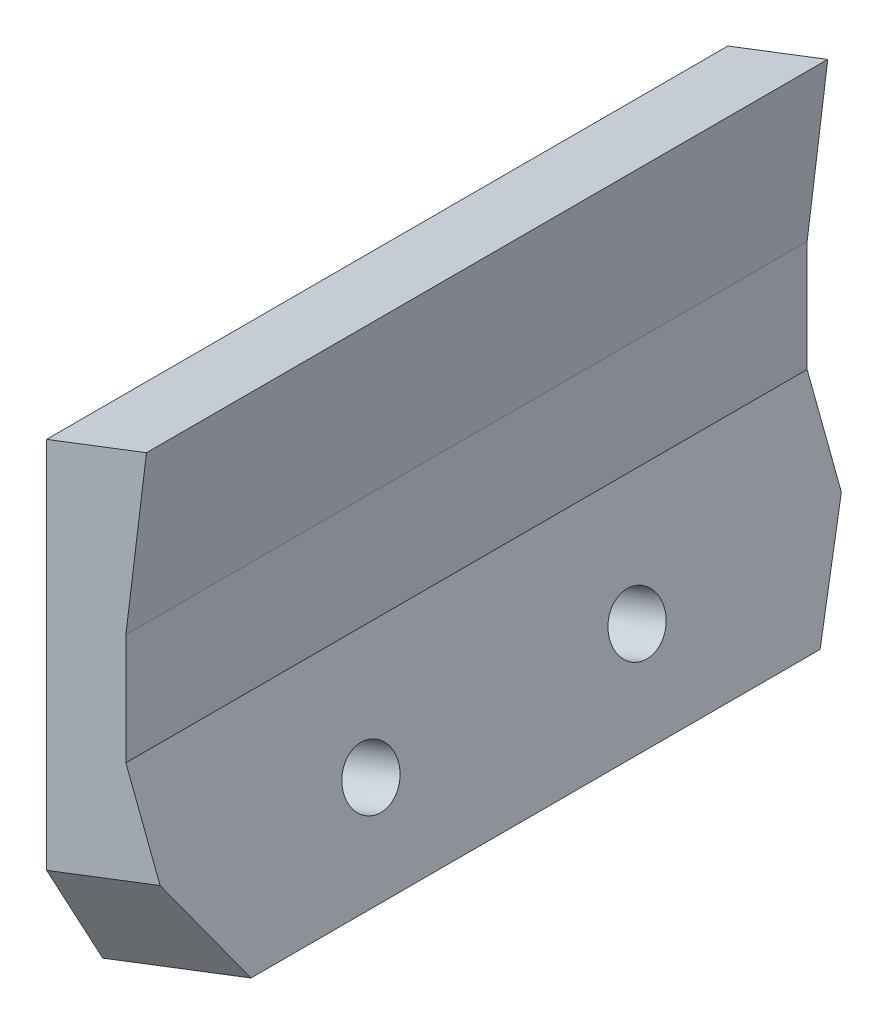
ISO-10303-21;
HEADER;
FILE_DESCRIPTION(('STEP AP214'),'2;1');
FILE_NAME('part.step','',(''),(''),'','','');
FILE_SCHEMA(('AUTOMOTIVE_DESIGN { 1 0 10303 214 1 1 1 1 }'));
ENDSEC;
DATA;
#1=APPLICATION_CONTEXT('core data for automotive mechanical design processes');
#2=APPLICATION_PROTOCOL_DEFINITION('international standard','automotive_design',2000,#1);
#3=PRODUCT_CONTEXT('',#1,'mechanical');
#4=PRODUCT('Part','Part','',(#3));
#5=PRODUCT_RELATED_PRODUCT_CATEGORY('part','',(#4));
#6=PRODUCT_DEFINITION_FORMATION('','',#4);
#7=PRODUCT_DEFINITION_CONTEXT('part definition',#1,'design');
#8=PRODUCT_DEFINITION('design','',#6,#7);
#9=PRODUCT_DEFINITION_SHAPE('','',#8);
#10=(LENGTH_UNIT() NAMED_UNIT(*) SI_UNIT(.MILLI.,.METRE.));
#11=(NAMED_UNIT(*) PLANE_ANGLE_UNIT() SI_UNIT($,.RADIAN.));
#12=(NAMED_UNIT(*) SI_UNIT($,.STERADIAN.) SOLID_ANGLE_UNIT());
#13=UNCERTAINTY_MEASURE_WITH_UNIT(LENGTH_MEASURE(1.E-05),#10,'distance_accuracy_value','');
#14=(GEOMETRIC_REPRESENTATION_CONTEXT(3) GLOBAL_UNCERTAINTY_ASSIGNED_CONTEXT((#13)) GLOBAL_UNIT_ASSIGNED_CONTEXT((#10,
#11,#12)) REPRESENTATION_CONTEXT('',''));
#15=CARTESIAN_POINT('',(0.,0.,0.));
#16=DIRECTION('',(0.,0.,1.));
#17=DIRECTION('',(1.,0.,0.));
#18=AXIS2_PLACEMENT_3D('',#15,#16,#17);
#19=CARTESIAN_POINT('',(0.,-9.65690762371426,40.6399993896484));
#20=DIRECTION('',(-1.,0.,0.));
#21=DIRECTION('',(0.,-1.,0.));
#22=AXIS2_PLACEMENT_3D('',#19,#20,#21);
#23=PLANE('',#22);
#24=DIRECTION('',(0.,0.,1.));
#25=VECTOR('',#24,1.);
#26=CARTESIAN_POINT('',(0.,3.39544010162354,40.6399993896484));
#27=LINE('',#26,#25);
#28=CARTESIAN_POINT('',(0.,3.39544010162354,30.0523240640651));
#29=VERTEX_POINT('',#28);
#30=CARTESIAN_POINT('',(0.,3.39544010162353,30.0903989386089));
#31=VERTEX_POINT('',#30);
#32=EDGE_CURVE('E173',#29,#31,#27,.T.);
#33=ORIENTED_EDGE('',*,*,#32,.F.);
#34=CARTESIAN_POINT('',(0.,5.62720646845574,28.2575012896484));
#35=DIRECTION('',(-1.,0.,0.));
#36=DIRECTION('',(0.,1.,0.));
#37=AXIS2_PLACEMENT_3D('',#34,#35,#36);
#38=ELLIPSE('',#37,2.94564880248301,2.74999999999999);
#39=CARTESIAN_POINT('',(0.,3.39544010162354,26.4626785152318));
#40=VERTEX_POINT('',#39);
#41=EDGE_CURVE('E157',#40,#29,#38,.T.);
#42=ORIENTED_EDGE('',*,*,#41,.F.);
#43=CARTESIAN_POINT('',(0.,3.39544010162353,26.424603640688));
#44=VERTEX_POINT('',#43);
#45=EDGE_CURVE('E174',#44,#40,#27,.T.);
#46=ORIENTED_EDGE('',*,*,#45,.F.);
#47=CARTESIAN_POINT('',(0.,4.67469921454694,28.2575012896484));
#48=DIRECTION('',(-1.,0.,0.));
#49=DIRECTION('',(0.,-1.,0.));
#50=AXIS2_PLACEMENT_3D('',#47,#48,#49);
#51=ELLIPSE('',#50,2.48136577217717,2.13908229033572);
#52=CARTESIAN_POINT('',(0.,3.46520079311664,26.3897388089768));
#53=VERTEX_POINT('',#52);
#54=EDGE_CURVE('E240',#53,#44,#51,.T.);
#55=ORIENTED_EDGE('',*,*,#54,.F.);
#56=CARTESIAN_POINT('',(0.,5.62720646845574,28.2575012896484));
#57=DIRECTION('',(-1.,0.,0.));
#58=DIRECTION('',(0.,-1.,0.));
#59=AXIS2_PLACEMENT_3D('',#56,#57,#58);
#60=ELLIPSE('',#59,2.94564880248301,2.75);
#61=CARTESIAN_POINT('',(0.,3.46520079311664,30.1252637703201));
#62=VERTEX_POINT('',#61);
#63=EDGE_CURVE('E244',#62,#53,#60,.T.);
#64=ORIENTED_EDGE('',*,*,#63,.F.);
#65=EDGE_CURVE('E245',#31,#62,#51,.T.);
#66=ORIENTED_EDGE('',*,*,#65,.F.);
#67=EDGE_LOOP('',(#33,#42,#46,#55,#64,#66));
#68=FACE_BOUND('',#67,.T.);
#69=DIRECTION('',(0.,-0.880271957562326,0.474469472916215));
#70=VECTOR('',#69,1.);
#71=CARTESIAN_POINT('',(0.,-14.2798205492988,11.0434292869699));
#72=LINE('',#71,#70);
#73=CARTESIAN_POINT('',(0.,6.20879183078859,0.));
#74=VERTEX_POINT('',#73);
#75=CARTESIAN_POINT('',(0.,-5.58965280230425E-07,3.34655946629032));
#76=VERTEX_POINT('',#75);
#77=EDGE_CURVE('E178',#74,#76,#72,.T.);
#78=ORIENTED_EDGE('',*,*,#77,.T.);
#79=DIRECTION('',(0.,0.,-1.));
#80=VECTOR('',#79,1.);
#81=CARTESIAN_POINT('',(0.,-5.58965280230425E-07,40.6399993896484));
#82=LINE('',#81,#80);
#83=CARTESIAN_POINT('',(0.,-5.58965280230425E-07,37.2934399233581));
#84=VERTEX_POINT('',#83);
#85=EDGE_CURVE('E230',#84,#76,#82,.T.);
#86=ORIENTED_EDGE('',*,*,#85,.F.);
#87=DIRECTION('',(0.,-0.880271957562326,-0.474469472916215));
#88=VECTOR('',#87,1.);
#89=CARTESIAN_POINT('',(0.,-13.9346296955527,29.782629105269));
#90=LINE('',#89,#88);
#91=CARTESIAN_POINT('',(0.,6.20879183078859,40.6399993896484));
#92=VERTEX_POINT('',#91);
#93=EDGE_CURVE('E186',#92,#84,#90,.T.);
#94=ORIENTED_EDGE('',*,*,#93,.F.);
#95=DIRECTION('',(0.,1.,0.));
#96=VECTOR('',#95,1.);
#97=CARTESIAN_POINT('',(0.,-9.65690762371426,40.6399993896484));
#98=LINE('',#97,#96);
#99=CARTESIAN_POINT('',(0.,28.4744606018067,40.6399993896484));
#100=VERTEX_POINT('',#99);
#101=EDGE_CURVE('E209',#92,#100,#98,.T.);
#102=ORIENTED_EDGE('',*,*,#101,.T.);
#103=DIRECTION('',(0.,0.,-1.));
#104=VECTOR('',#103,1.);
#105=CARTESIAN_POINT('',(0.,28.4744606018067,40.6399993896484));
#106=LINE('',#105,#104);
#107=CARTESIAN_POINT('',(0.,28.4744606018067,0.));
#108=VERTEX_POINT('',#107);
#109=EDGE_CURVE('E233',#100,#108,#106,.T.);
#110=ORIENTED_EDGE('',*,*,#109,.T.);
#111=DIRECTION('',(0.,1.,0.));
#112=VECTOR('',#111,1.);
#113=CARTESIAN_POINT('',(0.,-9.65690762371426,0.));
#114=LINE('',#113,#112);
#115=EDGE_CURVE('E222',#74,#108,#114,.T.);
#116=ORIENTED_EDGE('',*,*,#115,.F.);
#117=EDGE_LOOP('',(#78,#86,#94,#102,#110,#116));
#118=FACE_BOUND('',#117,.T.);
#119=DIRECTION('',(0.,0.,1.));
#120=VECTOR('',#119,1.);
#121=CARTESIAN_POINT('',(0.,3.39544010162354,40.6399993896484));
#122=LINE('',#121,#120);
#123=CARTESIAN_POINT('',(0.,3.39544010162354,14.1773208744166));
#124=VERTEX_POINT('',#123);
#125=CARTESIAN_POINT('',(0.,3.39544010162353,14.2153957489604));
#126=VERTEX_POINT('',#125);
#127=EDGE_CURVE('E142',#124,#126,#122,.T.);
#128=ORIENTED_EDGE('',*,*,#127,.F.);
#129=CARTESIAN_POINT('',(0.,5.62720646845574,12.3824981));
#130=DIRECTION('',(-1.,0.,0.));
#131=DIRECTION('',(0.,1.,0.));
#132=AXIS2_PLACEMENT_3D('',#129,#130,#131);
#133=ELLIPSE('',#132,2.94564880248301,2.75);
#134=CARTESIAN_POINT('',(0.,3.39544010162354,10.5876753255833));
#135=VERTEX_POINT('',#134);
#136=EDGE_CURVE('E48',#135,#124,#133,.T.);
#137=ORIENTED_EDGE('',*,*,#136,.F.);
#138=CARTESIAN_POINT('',(0.,3.39544010162353,10.5496004510396));
#139=VERTEX_POINT('',#138);
#140=EDGE_CURVE('E140',#139,#135,#122,.T.);
#141=ORIENTED_EDGE('',*,*,#140,.F.);
#142=CARTESIAN_POINT('',(0.,4.67469921454694,12.3824981));
#143=DIRECTION('',(-1.,0.,0.));
#144=DIRECTION('',(0.,-1.,0.));
#145=AXIS2_PLACEMENT_3D('',#142,#143,#144);
#146=ELLIPSE('',#145,2.48136577217717,2.13908229033572);
#147=CARTESIAN_POINT('',(0.,3.46520079311664,10.5147356193283));
#148=VERTEX_POINT('',#147);
#149=EDGE_CURVE('E42',#148,#139,#146,.T.);
#150=ORIENTED_EDGE('',*,*,#149,.F.);
#151=CARTESIAN_POINT('',(0.,5.62720646845574,12.3824981));
#152=DIRECTION('',(-1.,0.,0.));
#153=DIRECTION('',(0.,-1.,0.));
#154=AXIS2_PLACEMENT_3D('',#151,#152,#153);
#155=ELLIPSE('',#154,2.94564880248301,2.75);
#156=CARTESIAN_POINT('',(0.,3.46520079311664,14.2502605806717));
#157=VERTEX_POINT('',#156);
#158=EDGE_CURVE('E37',#157,#148,#155,.T.);
#159=ORIENTED_EDGE('',*,*,#158,.F.);
#160=EDGE_CURVE('E11',#126,#157,#146,.T.);
#161=ORIENTED_EDGE('',*,*,#160,.F.);
#162=EDGE_LOOP('',(#128,#137,#141,#150,#159,#161));
#163=FACE_BOUND('',#162,.T.);
#164=ADVANCED_FACE('F33',(#68,#118,#163),#23,.T.);
#165=CARTESIAN_POINT('',(-0.746671693791582,5.34058600620903,15.1574981));
#166=DIRECTION('',(-0.933580404317685,-0.358368007324911,0.));
#167=DIRECTION('',(0.358368007324911,-0.933580404317685,0.));
#168=AXIS2_PLACEMENT_3D('',#165,#166,#167);
#169=PLANE('',#168);
#170=CARTESIAN_POINT('',(-0.746671693791582,5.34058600620903,12.3824981));
#171=DIRECTION('',(-0.933580404317685,-0.358368007324911,0.));
#172=DIRECTION('',(0.358368007324911,-0.933580404317685,0.));
#173=AXIS2_PLACEMENT_3D('',#170,#171,#172);
#174=CIRCLE('',#173,2.75);
#175=EDGE_CURVE('E131',#135,#124,#174,.T.);
#176=ORIENTED_EDGE('',*,*,#175,.T.);
#177=ORIENTED_EDGE('',*,*,#127,.T.);
#178=CARTESIAN_POINT('',(-0.746671693791583,5.34058600620903,12.3824981));
#179=DIRECTION('',(-0.933580404317685,-0.358368007324911,0.));
#180=DIRECTION('',(0.358368007324911,-0.933580404317685,0.));
#181=AXIS2_PLACEMENT_3D('',#178,#179,#180);
#182=CIRCLE('',#181,2.775);
#183=EDGE_CURVE('E143',#139,#126,#182,.T.);
#184=ORIENTED_EDGE('',*,*,#183,.F.);
#185=ORIENTED_EDGE('',*,*,#140,.T.);
#186=EDGE_LOOP('',(#176,#177,#184,#185));
#187=FACE_BOUND('',#186,.T.);
#188=ADVANCED_FACE('F146',(#187),#169,.F.);
#189=CARTESIAN_POINT('',(-0.746671693791582,5.34058600620903,31.0325012896484));
#190=DIRECTION('',(-0.933580404317685,-0.358368007324911,0.));
#191=DIRECTION('',(0.358368007324911,-0.933580404317685,0.));
#192=AXIS2_PLACEMENT_3D('',#189,#190,#191);
#193=PLANE('',#192);
#194=CARTESIAN_POINT('',(-0.746671693791581,5.34058600620903,28.2575012896484));
#195=DIRECTION('',(-0.933580404317685,-0.358368007324911,0.));
#196=DIRECTION('',(0.358368007324911,-0.933580404317685,0.));
#197=AXIS2_PLACEMENT_3D('',#194,#195,#196);
#198=CIRCLE('',#197,2.74999999999999);
#199=EDGE_CURVE('E151',#40,#29,#198,.T.);
#200=ORIENTED_EDGE('',*,*,#199,.T.);
#201=ORIENTED_EDGE('',*,*,#32,.T.);
#202=CARTESIAN_POINT('',(-0.746671693791583,5.34058600620903,28.2575012896484));
#203=DIRECTION('',(-0.933580404317685,-0.358368007324911,0.));
#204=DIRECTION('',(0.358368007324911,-0.933580404317685,0.));
#205=AXIS2_PLACEMENT_3D('',#202,#203,#204);
#206=CIRCLE('',#205,2.775);
#207=EDGE_CURVE('E159',#44,#31,#206,.T.);
#208=ORIENTED_EDGE('',*,*,#207,.F.);
#209=ORIENTED_EDGE('',*,*,#45,.T.);
#210=EDGE_LOOP('',(#200,#201,#208,#209));
#211=FACE_BOUND('',#210,.T.);
#212=ADVANCED_FACE('F262',(#211),#193,.F.);
#213=CARTESIAN_POINT('',(0.623846970061629,0.239471900506558,40.6399993896484));
#214=DIRECTION('',(-0.358368007324911,0.933580404317685,0.));
#215=DIRECTION('',(-0.933580404317685,-0.358368007324911,0.));
#216=AXIS2_PLACEMENT_3D('',#213,#214,#215);
#217=PLANE('',#216);
#218=ORIENTED_EDGE('',*,*,#85,.T.);
#219=DIRECTION('',(0.933580404317685,0.358368007324911,0.));
#220=VECTOR('',#219,1.);
#221=CARTESIAN_POINT('',(-1.16171387862518,-0.44594081846427,3.34655946629033));
#222=LINE('',#221,#220);
#223=CARTESIAN_POINT('',(8.84542369842529,3.39544010162354,3.34655946629033));
#224=VERTEX_POINT('',#223);
#225=EDGE_CURVE('E183',#76,#224,#222,.T.);
#226=ORIENTED_EDGE('',*,*,#225,.T.);
#227=DIRECTION('',(0.,0.,-1.));
#228=VECTOR('',#227,1.);
#229=CARTESIAN_POINT('',(8.84542369842529,3.39544010162354,40.6399993896484));
#230=LINE('',#229,#228);
#231=CARTESIAN_POINT('',(8.84542369842529,3.39544010162354,37.2934399233581));
#232=VERTEX_POINT('',#231);
#233=EDGE_CURVE('E227',#232,#224,#230,.T.);
#234=ORIENTED_EDGE('',*,*,#233,.F.);
#235=DIRECTION('',(0.933580404317685,0.358368007324911,0.));
#236=VECTOR('',#235,1.);
#237=CARTESIAN_POINT('',(-0.00120613772050179,-0.000463551943127947,37.2934399233581));
#238=LINE('',#237,#236);
#239=EDGE_CURVE('E194',#84,#232,#238,.T.);
#240=ORIENTED_EDGE('',*,*,#239,.F.);
#241=EDGE_LOOP('',(#218,#226,#234,#240));
#242=FACE_BOUND('',#241,.T.);
#243=ADVANCED_FACE('F284',(#242),#217,.F.);
#244=CARTESIAN_POINT('',(12.6442885775763,-6.50093942259728,40.6399993896484));
#245=DIRECTION('',(-0.933580404317685,-0.358368007324911,0.));
#246=DIRECTION('',(0.358368007324911,-0.933580404317685,0.));
#247=AXIS2_PLACEMENT_3D('',#244,#245,#246);
#248=PLANE('',#247);
#249=CARTESIAN_POINT('',(6.96275521442791,8.29995827445505,12.3824981));
#250=DIRECTION('',(-0.933580404317685,-0.358368007324911,0.));
#251=DIRECTION('',(0.358368007324911,-0.933580404317685,0.));
#252=AXIS2_PLACEMENT_3D('',#249,#250,#251);
#253=CIRCLE('',#252,1.635);
#254=CARTESIAN_POINT('',(7.54868690640414,6.77355431339564,12.3824981));
#255=VERTEX_POINT('',#254);
#256=EDGE_CURVE('E148',#255,#255,#253,.T.);
#257=ORIENTED_EDGE('',*,*,#256,.T.);
#258=EDGE_LOOP('',(#257));
#259=FACE_BOUND('',#258,.T.);
#260=CARTESIAN_POINT('',(6.96275521442791,8.29995827445505,28.2575012896484));
#261=DIRECTION('',(-0.933580404317685,-0.358368007324911,0.));
#262=DIRECTION('',(0.358368007324911,-0.933580404317685,0.));
#263=AXIS2_PLACEMENT_3D('',#260,#261,#262);
#264=CIRCLE('',#263,1.635);
#265=CARTESIAN_POINT('',(7.54868690640414,6.77355431339564,28.2575012896484));
#266=VERTEX_POINT('',#265);
#267=EDGE_CURVE('E177',#266,#266,#264,.T.);
#268=ORIENTED_EDGE('',*,*,#267,.T.);
#269=EDGE_LOOP('',(#268));
#270=FACE_BOUND('',#269,.T.);
#271=ORIENTED_EDGE('',*,*,#233,.T.);
#272=DIRECTION('',(0.310355743139991,-0.808504203055873,0.500000266340942));
#273=VECTOR('',#272,1.);
#274=CARTESIAN_POINT('',(14.02255420383,-10.0914434695963,11.6872030303327));
#275=LINE('',#274,#273);
#276=CARTESIAN_POINT('',(6.76817690460516,8.80685200783197,0.));
#277=VERTEX_POINT('',#276);
#278=EDGE_CURVE('E181',#277,#224,#275,.T.);
#279=ORIENTED_EDGE('',*,*,#278,.F.);
#280=DIRECTION('',(-0.358368007324911,0.933580404317685,0.));
#281=VECTOR('',#280,1.);
#282=CARTESIAN_POINT('',(12.6442885775763,-6.50093942259728,0.));
#283=LINE('',#282,#281);
#284=CARTESIAN_POINT('',(4.72652101516724,14.1255464553833,0.));
#285=VERTEX_POINT('',#284);
#286=EDGE_CURVE('E203',#277,#285,#283,.T.);
#287=ORIENTED_EDGE('',*,*,#286,.T.);
#288=DIRECTION('',(0.,0.,-1.));
#289=VECTOR('',#288,1.);
#290=CARTESIAN_POINT('',(4.72652101516724,14.1255464553833,40.6399993896484));
#291=LINE('',#290,#289);
#292=CARTESIAN_POINT('',(4.72652101516724,14.1255464553833,40.6399993896484));
#293=VERTEX_POINT('',#292);
#294=EDGE_CURVE('E213',#293,#285,#291,.T.);
#295=ORIENTED_EDGE('',*,*,#294,.F.);
#296=DIRECTION('',(-0.358368007324911,0.933580404317685,0.));
#297=VECTOR('',#296,1.);
#298=CARTESIAN_POINT('',(12.6442885775763,-6.50093942259728,40.6399993896484));
#299=LINE('',#298,#297);
#300=CARTESIAN_POINT('',(6.76817690460516,8.80685200783197,40.6399993896484));
#301=VERTEX_POINT('',#300);
#302=EDGE_CURVE('E211',#301,#293,#299,.T.);
#303=ORIENTED_EDGE('',*,*,#302,.F.);
#304=DIRECTION('',(0.310355743139991,-0.808504203055873,-0.500000266340942));
#305=VECTOR('',#304,1.);
#306=CARTESIAN_POINT('',(14.02255420383,-10.0914434695963,28.9527963593157));
#307=LINE('',#306,#305);
#308=EDGE_CURVE('E190',#301,#232,#307,.T.);
#309=ORIENTED_EDGE('',*,*,#308,.T.);
#310=EDGE_LOOP('',(#271,#279,#287,#295,#303,#309));
#311=FACE_BOUND('',#310,.T.);
#312=ADVANCED_FACE('F314',(#259,#270,#311),#248,.F.);
#313=CARTESIAN_POINT('',(4.42271184921265,-9.65690762371426,40.6399993896484));
#314=DIRECTION('',(0.,0.,1.));
#315=DIRECTION('',(1.,0.,0.));
#316=AXIS2_PLACEMENT_3D('',#313,#314,#315);
#317=PLANE('',#316);
#318=ORIENTED_EDGE('',*,*,#101,.F.);
#319=DIRECTION('',(0.933580404317685,0.358368007324911,0.));
#320=VECTOR('',#319,1.);
#321=CARTESIAN_POINT('',(-2.07845293154063,5.41094835426531,40.6399993896484));
#322=LINE('',#321,#320);
#323=EDGE_CURVE('E193',#92,#301,#322,.T.);
#324=ORIENTED_EDGE('',*,*,#323,.T.);
#325=ORIENTED_EDGE('',*,*,#302,.T.);
#326=DIRECTION('',(0.,-1.,0.));
#327=VECTOR('',#326,1.);
#328=CARTESIAN_POINT('',(4.72652101516727,-9.65690762371426,40.6399993896484));
#329=LINE('',#328,#327);
#330=CARTESIAN_POINT('',(4.72652101516723,20.7436413689573,40.6399993896484));
#331=VERTEX_POINT('',#330);
#332=EDGE_CURVE('E199',#331,#293,#329,.T.);
#333=ORIENTED_EDGE('',*,*,#332,.F.);
#334=DIRECTION('',(-0.121869402403445,-0.99254614439724,0.));
#335=VECTOR('',#334,1.);
#336=CARTESIAN_POINT('',(1.0447278223239,-9.24214313441656,40.6399993896484));
#337=LINE('',#336,#335);
#338=CARTESIAN_POINT('',(5.95649172106876,30.7609439714815,40.6399993896484));
#339=VERTEX_POINT('',#338);
#340=EDGE_CURVE('E202',#339,#331,#337,.T.);
#341=ORIENTED_EDGE('',*,*,#340,.F.);
#342=DIRECTION('',(-0.933580404317685,-0.358368007324911,0.));
#343=VECTOR('',#342,1.);
#344=CARTESIAN_POINT('',(-8.90272107070259,25.0570255366299,40.6399993896484));
#345=LINE('',#344,#343);
#346=EDGE_CURVE('E206',#339,#100,#345,.T.);
#347=ORIENTED_EDGE('',*,*,#346,.T.);
#348=EDGE_LOOP('',(#318,#324,#325,#333,#341,#347));
#349=FACE_BOUND('',#348,.T.);
#350=ADVANCED_FACE('F296',(#349),#317,.T.);
#351=CARTESIAN_POINT('',(4.72652101516727,-9.65690762371426,40.6399993896484));
#352=DIRECTION('',(1.,0.,0.));
#353=DIRECTION('',(0.,1.,0.));
#354=AXIS2_PLACEMENT_3D('',#351,#352,#353);
#355=PLANE('',#354);
#356=DIRECTION('',(0.,-1.,0.));
#357=VECTOR('',#356,1.);
#358=CARTESIAN_POINT('',(4.72652101516727,-9.65690762371426,0.));
#359=LINE('',#358,#357);
#360=CARTESIAN_POINT('',(4.72652101516723,20.7436413689573,0.));
#361=VERTEX_POINT('',#360);
#362=EDGE_CURVE('E196',#361,#285,#359,.T.);
#363=ORIENTED_EDGE('',*,*,#362,.F.);
#364=DIRECTION('',(0.,0.,-1.));
#365=VECTOR('',#364,1.);
#366=CARTESIAN_POINT('',(4.72652101516723,20.7436413689573,40.6399993896484));
#367=LINE('',#366,#365);
#368=EDGE_CURVE('E238',#331,#361,#367,.T.);
#369=ORIENTED_EDGE('',*,*,#368,.F.);
#370=ORIENTED_EDGE('',*,*,#332,.T.);
#371=ORIENTED_EDGE('',*,*,#294,.T.);
#372=EDGE_LOOP('',(#363,#369,#370,#371));
#373=FACE_BOUND('',#372,.T.);
#374=ADVANCED_FACE('F35',(#373),#355,.T.);
#375=CARTESIAN_POINT('',(1.0447278223239,-9.24214313441656,40.6399993896484));
#376=DIRECTION('',(0.99254614439724,-0.121869402403445,0.));
#377=DIRECTION('',(0.121869402403445,0.99254614439724,0.));
#378=AXIS2_PLACEMENT_3D('',#375,#376,#377);
#379=PLANE('',#378);
#380=DIRECTION('',(-0.121869402403445,-0.99254614439724,0.));
#381=VECTOR('',#380,1.);
#382=CARTESIAN_POINT('',(1.0447278223239,-9.24214313441656,0.));
#383=LINE('',#382,#381);
#384=CARTESIAN_POINT('',(5.95649172106876,30.7609439714815,0.));
#385=VERTEX_POINT('',#384);
#386=EDGE_CURVE('E216',#385,#361,#383,.T.);
#387=ORIENTED_EDGE('',*,*,#386,.F.);
#388=DIRECTION('',(0.,0.,-1.));
#389=VECTOR('',#388,1.);
#390=CARTESIAN_POINT('',(5.95649172106876,30.7609439714815,40.6399993896484));
#391=LINE('',#390,#389);
#392=EDGE_CURVE('E236',#339,#385,#391,.T.);
#393=ORIENTED_EDGE('',*,*,#392,.F.);
#394=ORIENTED_EDGE('',*,*,#340,.T.);
#395=ORIENTED_EDGE('',*,*,#368,.T.);
#396=EDGE_LOOP('',(#387,#393,#394,#395));
#397=FACE_BOUND('',#396,.T.);
#398=ADVANCED_FACE('F289',(#397),#379,.T.);
#399=CARTESIAN_POINT('',(-8.90272107070259,25.0570255366299,40.6399993896484));
#400=DIRECTION('',(0.358368007324911,-0.933580404317685,0.));
#401=DIRECTION('',(0.933580404317685,0.358368007324911,0.));
#402=AXIS2_PLACEMENT_3D('',#399,#400,#401);
#403=PLANE('',#402);
#404=DIRECTION('',(-0.933580404317685,-0.358368007324911,0.));
#405=VECTOR('',#404,1.);
#406=CARTESIAN_POINT('',(-8.90272107070259,25.0570255366299,0.));
#407=LINE('',#406,#405);
#408=EDGE_CURVE('E219',#385,#108,#407,.T.);
#409=ORIENTED_EDGE('',*,*,#408,.T.);
#410=ORIENTED_EDGE('',*,*,#109,.F.);
#411=ORIENTED_EDGE('',*,*,#346,.F.);
#412=ORIENTED_EDGE('',*,*,#392,.T.);
#413=EDGE_LOOP('',(#409,#410,#411,#412));
#414=FACE_BOUND('',#413,.T.);
#415=ADVANCED_FACE('F286',(#414),#403,.F.);
#416=CARTESIAN_POINT('',(4.42271184921265,-9.65690762371426,0.));
#417=DIRECTION('',(0.,0.,1.));
#418=DIRECTION('',(1.,0.,0.));
#419=AXIS2_PLACEMENT_3D('',#416,#417,#418);
#420=PLANE('',#419);
#421=ORIENTED_EDGE('',*,*,#286,.F.);
#422=DIRECTION('',(0.933580404317685,0.358368007324911,0.));
#423=VECTOR('',#422,1.);
#424=CARTESIAN_POINT('',(-3.23896067244532,4.96547108774416,0.));
#425=LINE('',#424,#423);
#426=EDGE_CURVE('E184',#74,#277,#425,.T.);
#427=ORIENTED_EDGE('',*,*,#426,.F.);
#428=ORIENTED_EDGE('',*,*,#115,.T.);
#429=ORIENTED_EDGE('',*,*,#408,.F.);
#430=ORIENTED_EDGE('',*,*,#386,.T.);
#431=ORIENTED_EDGE('',*,*,#362,.T.);
#432=EDGE_LOOP('',(#421,#427,#428,#429,#430,#431));
#433=FACE_BOUND('',#432,.T.);
#434=ADVANCED_FACE('F288',(#433),#420,.F.);
#435=CARTESIAN_POINT('',(5.17592436768418,-13.4873471231629,28.9527963593157));
#436=DIRECTION('',(0.179184099110528,-0.466790450809526,0.86602525001237));
#437=DIRECTION('',(0.,-0.880271957562326,-0.474469472916215));
#438=AXIS2_PLACEMENT_3D('',#435,#436,#437);
#439=PLANE('',#438);
#440=ORIENTED_EDGE('',*,*,#93,.T.);
#441=ORIENTED_EDGE('',*,*,#239,.T.);
#442=ORIENTED_EDGE('',*,*,#308,.F.);
#443=ORIENTED_EDGE('',*,*,#323,.F.);
#444=EDGE_LOOP('',(#440,#441,#442,#443));
#445=FACE_BOUND('',#444,.T.);
#446=ADVANCED_FACE('F320',(#445),#439,.T.);
#447=CARTESIAN_POINT('',(4.0154166267795,-13.9328243896841,11.6872030303327));
#448=DIRECTION('',(-0.179184099110528,0.466790450809526,0.86602525001237));
#449=DIRECTION('',(0.,-0.880271957562326,0.474469472916215));
#450=AXIS2_PLACEMENT_3D('',#447,#448,#449);
#451=PLANE('',#450);
#452=ORIENTED_EDGE('',*,*,#426,.T.);
#453=ORIENTED_EDGE('',*,*,#278,.T.);
#454=ORIENTED_EDGE('',*,*,#225,.F.);
#455=ORIENTED_EDGE('',*,*,#77,.F.);
#456=EDGE_LOOP('',(#452,#453,#454,#455));
#457=FACE_BOUND('',#456,.T.);
#458=ADVANCED_FACE('F324',(#457),#451,.F.);
#459=CARTESIAN_POINT('',(-0.74667169379158,5.34058600620903,28.2575012896484));
#460=DIRECTION('',(-0.933580404317685,-0.358368007324911,0.));
#461=DIRECTION('',(0.358368007324911,-0.933580404317685,0.));
#462=AXIS2_PLACEMENT_3D('',#459,#460,#461);
#463=CYLINDRICAL_SURFACE('',#462,1.635);
#464=CARTESIAN_POINT('',(1.58727931700262,6.23650602452131,28.2575012896484));
#465=DIRECTION('',(-0.933580404317685,-0.358368007324911,0.));
#466=DIRECTION('',(0.358368007324911,-0.933580404317685,0.));
#467=AXIS2_PLACEMENT_3D('',#464,#465,#466);
#468=CIRCLE('',#467,1.63500000000001);
#469=CARTESIAN_POINT('',(2.17321100897886,4.71010206346188,28.2575012896484));
#470=VERTEX_POINT('',#469);
#471=EDGE_CURVE('E170',#470,#470,#468,.T.);
#472=ORIENTED_EDGE('',*,*,#471,.T.);
#473=EDGE_LOOP('',(#472));
#474=FACE_BOUND('',#473,.T.);
#475=ORIENTED_EDGE('',*,*,#267,.F.);
#476=EDGE_LOOP('',(#475));
#477=FACE_BOUND('',#476,.T.);
#478=ADVANCED_FACE('F326',(#474,#477),#463,.F.);
#479=CARTESIAN_POINT('',(1.58727931700263,6.23650602452131,31.0075012896484));
#480=DIRECTION('',(0.933580404317685,0.358368007324911,0.));
#481=DIRECTION('',(-0.358368007324911,0.933580404317685,0.));
#482=AXIS2_PLACEMENT_3D('',#479,#480,#481);
#483=PLANE('',#482);
#484=ORIENTED_EDGE('',*,*,#471,.F.);
#485=EDGE_LOOP('',(#484));
#486=FACE_BOUND('',#485,.T.);
#487=CARTESIAN_POINT('',(1.58727931700262,6.23650602452131,28.2575012896484));
#488=DIRECTION('',(-0.933580404317685,-0.358368007324911,0.));
#489=DIRECTION('',(0.358368007324911,-0.933580404317685,0.));
#490=AXIS2_PLACEMENT_3D('',#487,#488,#489);
#491=CIRCLE('',#490,2.75);
#492=CARTESIAN_POINT('',(2.57279133714613,3.66915991264768,28.2575012896484));
#493=VERTEX_POINT('',#492);
#494=EDGE_CURVE('E167',#493,#493,#491,.T.);
#495=ORIENTED_EDGE('',*,*,#494,.T.);
#496=EDGE_LOOP('',(#495));
#497=FACE_BOUND('',#496,.T.);
#498=ADVANCED_FACE('F332',(#486,#497),#483,.F.);
#499=CARTESIAN_POINT('',(-0.74667169379158,5.34058600620903,28.2575012896484));
#500=DIRECTION('',(-0.933580404317685,-0.358368007324911,0.));
#501=DIRECTION('',(0.358368007324911,-0.933580404317685,0.));
#502=AXIS2_PLACEMENT_3D('',#499,#500,#501);
#503=CYLINDRICAL_SURFACE('',#502,2.75);
#504=ORIENTED_EDGE('',*,*,#63,.T.);
#505=CARTESIAN_POINT('',(-0.723332183683646,5.34954520639215,28.2575012896484));
#506=DIRECTION('',(-0.933580404317685,-0.358368007324911,0.));
#507=DIRECTION('',(0.358368007324911,-0.933580404317685,0.));
#508=AXIS2_PLACEMENT_3D('',#505,#506,#507);
#509=CIRCLE('',#508,2.75);
#510=EDGE_CURVE('E164',#53,#62,#509,.T.);
#511=ORIENTED_EDGE('',*,*,#510,.T.);
#512=EDGE_LOOP('',(#504,#511));
#513=FACE_BOUND('',#512,.T.);
#514=ORIENTED_EDGE('',*,*,#494,.F.);
#515=EDGE_LOOP('',(#514));
#516=FACE_BOUND('',#515,.T.);
#517=ADVANCED_FACE('F255',(#513,#516),#503,.F.);
#518=CARTESIAN_POINT('',(-0.746671693791583,5.34058600620903,28.2575012896484));
#519=DIRECTION('',(-0.933580404317685,-0.358368007324911,0.));
#520=DIRECTION('',(0.358368007324911,-0.933580404317685,0.));
#521=AXIS2_PLACEMENT_3D('',#518,#519,#520);
#522=CONICAL_SURFACE('',#521,2.775,0.785398163397639);
#523=ORIENTED_EDGE('',*,*,#65,.T.);
#524=ORIENTED_EDGE('',*,*,#510,.F.);
#525=ORIENTED_EDGE('',*,*,#54,.T.);
#526=ORIENTED_EDGE('',*,*,#207,.T.);
#527=EDGE_LOOP('',(#523,#524,#525,#526));
#528=FACE_BOUND('',#527,.T.);
#529=ADVANCED_FACE('F249',(#528),#522,.F.);
#530=CARTESIAN_POINT('',(-3.04438236262257,4.45857735436725,28.2575012896484));
#531=DIRECTION('',(0.933580404317685,0.358368007324911,0.));
#532=DIRECTION('',(-0.358368007324911,0.933580404317685,0.));
#533=AXIS2_PLACEMENT_3D('',#530,#531,#532);
#534=CYLINDRICAL_SURFACE('',#533,2.74999999999999);
#535=ORIENTED_EDGE('',*,*,#41,.T.);
#536=ORIENTED_EDGE('',*,*,#199,.F.);
#537=EDGE_LOOP('',(#535,#536));
#538=FACE_BOUND('',#537,.T.);
#539=ADVANCED_FACE('F264',(#538),#534,.F.);
#540=CARTESIAN_POINT('',(-0.74667169379158,5.34058600620903,12.3824981));
#541=DIRECTION('',(-0.933580404317685,-0.358368007324911,0.));
#542=DIRECTION('',(0.358368007324911,-0.933580404317685,0.));
#543=AXIS2_PLACEMENT_3D('',#540,#541,#542);
#544=CYLINDRICAL_SURFACE('',#543,1.635);
#545=CARTESIAN_POINT('',(1.58727931700262,6.23650602452131,12.3824981));
#546=DIRECTION('',(-0.933580404317685,-0.358368007324911,0.));
#547=DIRECTION('',(0.358368007324911,-0.933580404317685,0.));
#548=AXIS2_PLACEMENT_3D('',#545,#546,#547);
#549=CIRCLE('',#548,1.63500000000001);
#550=CARTESIAN_POINT('',(2.17321100897886,4.71010206346188,12.3824981));
#551=VERTEX_POINT('',#550);
#552=EDGE_CURVE('E153',#551,#551,#549,.T.);
#553=ORIENTED_EDGE('',*,*,#552,.T.);
#554=EDGE_LOOP('',(#553));
#555=FACE_BOUND('',#554,.T.);
#556=ORIENTED_EDGE('',*,*,#256,.F.);
#557=EDGE_LOOP('',(#556));
#558=FACE_BOUND('',#557,.T.);
#559=ADVANCED_FACE('F266',(#555,#558),#544,.F.);
#560=CARTESIAN_POINT('',(1.58727931700263,6.23650602452131,15.1324981));
#561=DIRECTION('',(0.933580404317685,0.358368007324911,0.));
#562=DIRECTION('',(-0.358368007324911,0.933580404317685,0.));
#563=AXIS2_PLACEMENT_3D('',#560,#561,#562);
#564=PLANE('',#563);
#565=ORIENTED_EDGE('',*,*,#552,.F.);
#566=EDGE_LOOP('',(#565));
#567=FACE_BOUND('',#566,.T.);
#568=CARTESIAN_POINT('',(1.58727931700262,6.23650602452131,12.3824981));
#569=DIRECTION('',(-0.933580404317685,-0.358368007324911,0.));
#570=DIRECTION('',(0.358368007324911,-0.933580404317685,0.));
#571=AXIS2_PLACEMENT_3D('',#568,#569,#570);
#572=CIRCLE('',#571,2.75);
#573=CARTESIAN_POINT('',(2.57279133714613,3.66915991264768,12.3824981));
#574=VERTEX_POINT('',#573);
#575=EDGE_CURVE('E506',#574,#574,#572,.T.);
#576=ORIENTED_EDGE('',*,*,#575,.T.);
#577=EDGE_LOOP('',(#576));
#578=FACE_BOUND('',#577,.T.);
#579=ADVANCED_FACE('F272',(#567,#578),#564,.F.);
#580=CARTESIAN_POINT('',(-0.74667169379158,5.34058600620903,12.3824981));
#581=DIRECTION('',(-0.933580404317685,-0.358368007324911,0.));
#582=DIRECTION('',(0.358368007324911,-0.933580404317685,0.));
#583=AXIS2_PLACEMENT_3D('',#580,#581,#582);
#584=CYLINDRICAL_SURFACE('',#583,2.75);
#585=ORIENTED_EDGE('',*,*,#158,.T.);
#586=CARTESIAN_POINT('',(-0.723332183683646,5.34954520639215,12.3824981));
#587=DIRECTION('',(-0.933580404317685,-0.358368007324911,0.));
#588=DIRECTION('',(0.358368007324911,-0.933580404317685,0.));
#589=AXIS2_PLACEMENT_3D('',#586,#587,#588);
#590=CIRCLE('',#589,2.75);
#591=EDGE_CURVE('E55',#148,#157,#590,.T.);
#592=ORIENTED_EDGE('',*,*,#591,.T.);
#593=EDGE_LOOP('',(#585,#592));
#594=FACE_BOUND('',#593,.T.);
#595=ORIENTED_EDGE('',*,*,#575,.F.);
#596=EDGE_LOOP('',(#595));
#597=FACE_BOUND('',#596,.T.);
#598=ADVANCED_FACE('F381',(#594,#597),#584,.F.);
#599=CARTESIAN_POINT('',(-0.746671693791583,5.34058600620903,12.3824981));
#600=DIRECTION('',(-0.933580404317685,-0.358368007324911,0.));
#601=DIRECTION('',(0.358368007324911,-0.933580404317685,0.));
#602=AXIS2_PLACEMENT_3D('',#599,#600,#601);
#603=CONICAL_SURFACE('',#602,2.775,0.785398163397639);
#604=ORIENTED_EDGE('',*,*,#160,.T.);
#605=ORIENTED_EDGE('',*,*,#591,.F.);
#606=ORIENTED_EDGE('',*,*,#149,.T.);
#607=ORIENTED_EDGE('',*,*,#183,.T.);
#608=EDGE_LOOP('',(#604,#605,#606,#607));
#609=FACE_BOUND('',#608,.T.);
#610=ADVANCED_FACE('F373',(#609),#603,.F.);
#611=CARTESIAN_POINT('',(-1.88387462171789,4.90405462088839,12.3824981));
#612=DIRECTION('',(0.933580404317685,0.358368007324911,0.));
#613=DIRECTION('',(-0.358368007324911,0.933580404317685,0.));
#614=AXIS2_PLACEMENT_3D('',#611,#612,#613);
#615=CYLINDRICAL_SURFACE('',#614,2.75);
#616=ORIENTED_EDGE('',*,*,#136,.T.);
#617=ORIENTED_EDGE('',*,*,#175,.F.);
#618=EDGE_LOOP('',(#616,#617));
#619=FACE_BOUND('',#618,.T.);
#620=ADVANCED_FACE('F132',(#619),#615,.F.);
#621=CLOSED_SHELL('',(#164,#188,#212,#243,#312,#350,#374,#398,#415,#434,#446,#458,#478,#498,
#517,#529,#539,#559,#579,#598,#610,#620));
#622=MANIFOLD_SOLID_BREP('B2',#621);
#623=ADVANCED_BREP_SHAPE_REPRESENTATION('',(#18,#622),#14);
#624=SHAPE_DEFINITION_REPRESENTATION(#9,#623);
ENDSEC;
END-ISO-10303-21;
